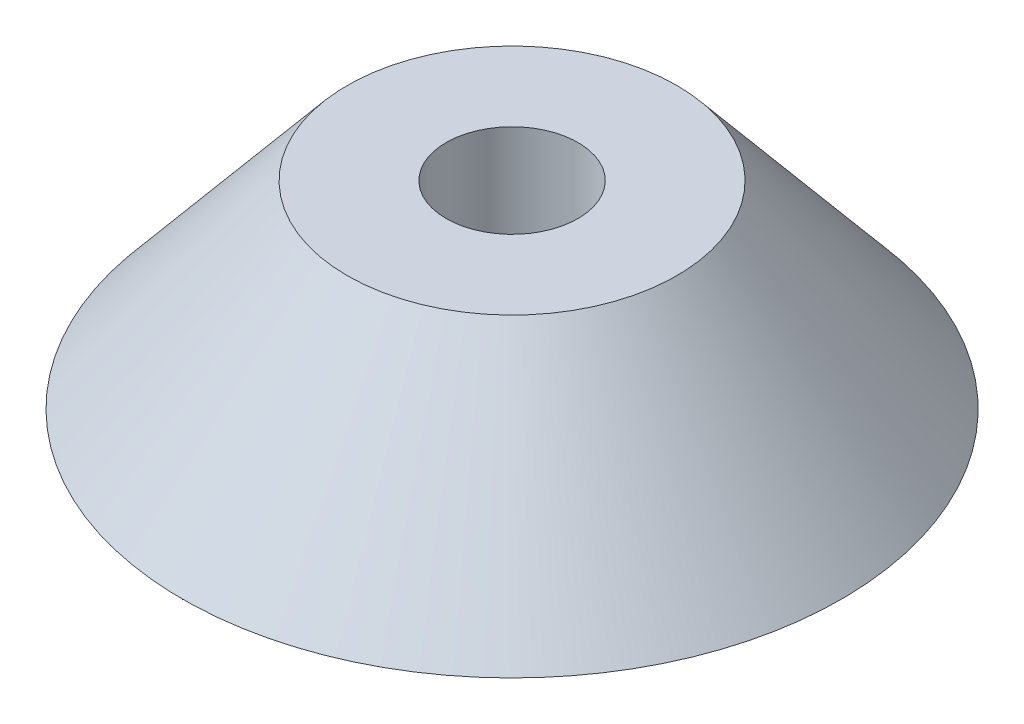
ISO-10303-21;
HEADER;
FILE_DESCRIPTION(('STEP AP214'),'2;1');
FILE_NAME('part.step','',(''),(''),'','','');
FILE_SCHEMA(('AUTOMOTIVE_DESIGN { 1 0 10303 214 1 1 1 1 }'));
ENDSEC;
DATA;
#1=APPLICATION_CONTEXT('core data for automotive mechanical design processes');
#2=APPLICATION_PROTOCOL_DEFINITION('international standard','automotive_design',2000,#1);
#3=PRODUCT_CONTEXT('',#1,'mechanical');
#4=PRODUCT('Part','Part','',(#3));
#5=PRODUCT_RELATED_PRODUCT_CATEGORY('part','',(#4));
#6=PRODUCT_DEFINITION_FORMATION('','',#4);
#7=PRODUCT_DEFINITION_CONTEXT('part definition',#1,'design');
#8=PRODUCT_DEFINITION('design','',#6,#7);
#9=PRODUCT_DEFINITION_SHAPE('','',#8);
#10=(LENGTH_UNIT() NAMED_UNIT(*) SI_UNIT(.MILLI.,.METRE.));
#11=(NAMED_UNIT(*) PLANE_ANGLE_UNIT() SI_UNIT($,.RADIAN.));
#12=(NAMED_UNIT(*) SI_UNIT($,.STERADIAN.) SOLID_ANGLE_UNIT());
#13=UNCERTAINTY_MEASURE_WITH_UNIT(LENGTH_MEASURE(1.E-05),#10,'distance_accuracy_value','');
#14=(GEOMETRIC_REPRESENTATION_CONTEXT(3) GLOBAL_UNCERTAINTY_ASSIGNED_CONTEXT((#13)) GLOBAL_UNIT_ASSIGNED_CONTEXT((#10,
#11,#12)) REPRESENTATION_CONTEXT('',''));
#15=CARTESIAN_POINT('',(0.,0.,0.));
#16=DIRECTION('',(0.,0.,1.));
#17=DIRECTION('',(1.,0.,0.));
#18=AXIS2_PLACEMENT_3D('',#15,#16,#17);
#19=CARTESIAN_POINT('',(1.5,-0.01,0.));
#20=DIRECTION('',(-0.957826285221151,0.,-0.287347885566345));
#21=DIRECTION('',(-0.287347885566345,0.,0.957826285221152));
#22=AXIS2_PLACEMENT_3D('',#19,#20,#21);
#23=PLANE('',#22);
#24=DIRECTION('',(-0.287347885566345,0.,0.957826285221151));
#25=VECTOR('',#24,1.);
#26=CARTESIAN_POINT('',(1.5,0.,0.));
#27=LINE('',#26,#25);
#28=CARTESIAN_POINT('',(1.5,0.,0.));
#29=VERTEX_POINT('',#28);
#30=CARTESIAN_POINT('',(0.,0.,5.));
#31=VERTEX_POINT('',#30);
#32=EDGE_CURVE('E102',#29,#31,#27,.T.);
#33=ORIENTED_EDGE('',*,*,#32,.T.);
#34=DIRECTION('',(0.,1.,0.));
#35=VECTOR('',#34,1.);
#36=CARTESIAN_POINT('',(0.,-0.01,5.));
#37=LINE('',#36,#35);
#38=CARTESIAN_POINT('',(0.,-0.01,5.));
#39=VERTEX_POINT('',#38);
#40=EDGE_CURVE('E12',#39,#31,#37,.T.);
#41=ORIENTED_EDGE('',*,*,#40,.F.);
#42=DIRECTION('',(-0.287347885566345,0.,0.957826285221151));
#43=VECTOR('',#42,1.);
#44=CARTESIAN_POINT('',(1.5,-0.01,0.));
#45=LINE('',#44,#43);
#46=CARTESIAN_POINT('',(1.5,-0.01,0.));
#47=VERTEX_POINT('',#46);
#48=EDGE_CURVE('E94',#47,#39,#45,.T.);
#49=ORIENTED_EDGE('',*,*,#48,.F.);
#50=DIRECTION('',(0.,1.,0.));
#51=VECTOR('',#50,1.);
#52=CARTESIAN_POINT('',(1.5,-0.01,0.));
#53=LINE('',#52,#51);
#54=EDGE_CURVE('E103',#47,#29,#53,.T.);
#55=ORIENTED_EDGE('',*,*,#54,.T.);
#56=EDGE_LOOP('',(#33,#41,#49,#55));
#57=FACE_BOUND('',#56,.T.);
#58=ADVANCED_FACE('F52',(#57),#23,.F.);
#59=CARTESIAN_POINT('',(-1.5,-0.01,0.));
#60=DIRECTION('',(0.957826285221151,0.,-0.287347885566345));
#61=DIRECTION('',(-0.287347885566345,0.,-0.957826285221152));
#62=AXIS2_PLACEMENT_3D('',#59,#60,#61);
#63=PLANE('',#62);
#64=DIRECTION('',(-0.287347885566345,0.,-0.957826285221151));
#65=VECTOR('',#64,1.);
#66=CARTESIAN_POINT('',(-1.5,0.,0.));
#67=LINE('',#66,#65);
#68=CARTESIAN_POINT('',(-1.5,0.,0.));
#69=VERTEX_POINT('',#68);
#70=EDGE_CURVE('E81',#31,#69,#67,.T.);
#71=ORIENTED_EDGE('',*,*,#70,.T.);
#72=DIRECTION('',(0.,1.,0.));
#73=VECTOR('',#72,1.);
#74=CARTESIAN_POINT('',(-1.5,-0.01,0.));
#75=LINE('',#74,#73);
#76=CARTESIAN_POINT('',(-1.5,-0.01,0.));
#77=VERTEX_POINT('',#76);
#78=EDGE_CURVE('E61',#77,#69,#75,.T.);
#79=ORIENTED_EDGE('',*,*,#78,.F.);
#80=DIRECTION('',(-0.287347885566345,0.,-0.957826285221151));
#81=VECTOR('',#80,1.);
#82=CARTESIAN_POINT('',(-1.5,-0.01,0.));
#83=LINE('',#82,#81);
#84=EDGE_CURVE('E89',#39,#77,#83,.T.);
#85=ORIENTED_EDGE('',*,*,#84,.F.);
#86=ORIENTED_EDGE('',*,*,#40,.T.);
#87=EDGE_LOOP('',(#71,#79,#85,#86));
#88=FACE_BOUND('',#87,.T.);
#89=ADVANCED_FACE('F90',(#88),#63,.F.);
#90=CARTESIAN_POINT('',(-1.5,-0.01,0.));
#91=DIRECTION('',(0.,0.,1.));
#92=DIRECTION('',(1.,0.,0.));
#93=AXIS2_PLACEMENT_3D('',#90,#91,#92);
#94=PLANE('',#93);
#95=DIRECTION('',(1.,0.,0.));
#96=VECTOR('',#95,1.);
#97=CARTESIAN_POINT('',(-1.5,0.,0.));
#98=LINE('',#97,#96);
#99=EDGE_CURVE('E86',#69,#29,#98,.T.);
#100=ORIENTED_EDGE('',*,*,#99,.T.);
#101=ORIENTED_EDGE('',*,*,#54,.F.);
#102=DIRECTION('',(1.,0.,0.));
#103=VECTOR('',#102,1.);
#104=CARTESIAN_POINT('',(-1.5,-0.01,0.));
#105=LINE('',#104,#103);
#106=EDGE_CURVE('E69',#77,#47,#105,.T.);
#107=ORIENTED_EDGE('',*,*,#106,.F.);
#108=ORIENTED_EDGE('',*,*,#78,.T.);
#109=EDGE_LOOP('',(#100,#101,#107,#108));
#110=FACE_BOUND('',#109,.T.);
#111=ADVANCED_FACE('F115',(#110),#94,.F.);
#112=CARTESIAN_POINT('',(0.,-0.01,0.));
#113=DIRECTION('',(0.,1.,0.));
#114=DIRECTION('',(0.,0.,1.));
#115=AXIS2_PLACEMENT_3D('',#112,#113,#114);
#116=PLANE('',#115);
#117=ORIENTED_EDGE('',*,*,#48,.T.);
#118=ORIENTED_EDGE('',*,*,#84,.T.);
#119=ORIENTED_EDGE('',*,*,#106,.T.);
#120=EDGE_LOOP('',(#117,#118,#119));
#121=FACE_BOUND('',#120,.T.);
#122=ADVANCED_FACE('F97',(#121),#116,.F.);
#123=CARTESIAN_POINT('',(0.,0.,0.));
#124=DIRECTION('',(0.,1.,0.));
#125=DIRECTION('',(0.,0.,1.));
#126=AXIS2_PLACEMENT_3D('',#123,#124,#125);
#127=PLANE('',#126);
#128=ORIENTED_EDGE('',*,*,#32,.F.);
#129=ORIENTED_EDGE('',*,*,#99,.F.);
#130=ORIENTED_EDGE('',*,*,#70,.F.);
#131=EDGE_LOOP('',(#128,#129,#130));
#132=FACE_BOUND('',#131,.T.);
#133=ADVANCED_FACE('F116',(#132),#127,.T.);
#134=CLOSED_SHELL('',(#58,#89,#111,#122,#133));
#135=MANIFOLD_SOLID_BREP('B2',#134);
#136=CARTESIAN_POINT('',(0.,0.,0.));
#137=DIRECTION('',(0.,1.,0.));
#138=DIRECTION('',(0.,0.,1.));
#139=AXIS2_PLACEMENT_3D('',#136,#137,#138);
#140=PLANE('',#139);
#141=CARTESIAN_POINT('',(0.,0.,0.));
#142=DIRECTION('',(0.,-1.,0.));
#143=DIRECTION('',(0.,0.,-1.));
#144=AXIS2_PLACEMENT_3D('',#141,#142,#143);
#145=CIRCLE('',#144,5.);
#146=CARTESIAN_POINT('',(0.,0.,-5.));
#147=VERTEX_POINT('',#146);
#148=EDGE_CURVE('E51',#147,#147,#145,.T.);
#149=ORIENTED_EDGE('',*,*,#148,.T.);
#150=EDGE_LOOP('',(#149));
#151=FACE_BOUND('',#150,.T.);
#152=ADVANCED_FACE('F175',(#151),#140,.F.);
#153=CARTESIAN_POINT('',(0.,3.,0.));
#154=DIRECTION('',(0.,-1.,0.));
#155=DIRECTION('',(0.,0.,-1.));
#156=AXIS2_PLACEMENT_3D('',#153,#154,#155);
#157=CONICAL_SURFACE('',#156,2.5,0.694738276196703);
#158=ORIENTED_EDGE('',*,*,#148,.F.);
#159=EDGE_LOOP('',(#158));
#160=FACE_BOUND('',#159,.T.);
#161=CARTESIAN_POINT('',(0.,3.,0.));
#162=DIRECTION('',(0.,-1.,0.));
#163=DIRECTION('',(0.,0.,-1.));
#164=AXIS2_PLACEMENT_3D('',#161,#162,#163);
#165=CIRCLE('',#164,2.5);
#166=CARTESIAN_POINT('',(0.,3.,-2.5));
#167=VERTEX_POINT('',#166);
#168=EDGE_CURVE('E182',#167,#167,#165,.T.);
#169=ORIENTED_EDGE('',*,*,#168,.T.);
#170=EDGE_LOOP('',(#169));
#171=FACE_BOUND('',#170,.T.);
#172=ADVANCED_FACE('F204',(#160,#171),#157,.T.);
#173=CARTESIAN_POINT('',(0.,3.,0.));
#174=DIRECTION('',(0.,-1.,0.));
#175=DIRECTION('',(0.,0.,-1.));
#176=AXIS2_PLACEMENT_3D('',#173,#174,#175);
#177=PLANE('',#176);
#178=CARTESIAN_POINT('',(0.,3.,0.));
#179=DIRECTION('',(0.,1.,0.));
#180=DIRECTION('',(0.,0.,1.));
#181=AXIS2_PLACEMENT_3D('',#178,#179,#180);
#182=CIRCLE('',#181,1.);
#183=CARTESIAN_POINT('',(0.,3.,1.));
#184=VERTEX_POINT('',#183);
#185=EDGE_CURVE('E193',#184,#184,#182,.T.);
#186=ORIENTED_EDGE('',*,*,#185,.F.);
#187=EDGE_LOOP('',(#186));
#188=FACE_BOUND('',#187,.T.);
#189=ORIENTED_EDGE('',*,*,#168,.F.);
#190=EDGE_LOOP('',(#189));
#191=FACE_BOUND('',#190,.T.);
#192=ADVANCED_FACE('F201',(#188,#191),#177,.F.);
#193=CARTESIAN_POINT('',(0.,1.2,0.));
#194=DIRECTION('',(0.,1.,0.));
#195=DIRECTION('',(0.,0.,1.));
#196=AXIS2_PLACEMENT_3D('',#193,#194,#195);
#197=CYLINDRICAL_SURFACE('',#196,1.);
#198=CARTESIAN_POINT('',(0.,1.2,0.));
#199=DIRECTION('',(0.,1.,0.));
#200=DIRECTION('',(0.,0.,1.));
#201=AXIS2_PLACEMENT_3D('',#198,#199,#200);
#202=CIRCLE('',#201,1.);
#203=CARTESIAN_POINT('',(0.,1.2,1.));
#204=VERTEX_POINT('',#203);
#205=EDGE_CURVE('E189',#204,#204,#202,.T.);
#206=ORIENTED_EDGE('',*,*,#205,.F.);
#207=EDGE_LOOP('',(#206));
#208=FACE_BOUND('',#207,.T.);
#209=ORIENTED_EDGE('',*,*,#185,.T.);
#210=EDGE_LOOP('',(#209));
#211=FACE_BOUND('',#210,.T.);
#212=ADVANCED_FACE('F199',(#208,#211),#197,.F.);
#213=CARTESIAN_POINT('',(0.,1.2,0.));
#214=DIRECTION('',(0.,1.,0.));
#215=DIRECTION('',(0.,0.,1.));
#216=AXIS2_PLACEMENT_3D('',#213,#214,#215);
#217=PLANE('',#216);
#218=ORIENTED_EDGE('',*,*,#205,.T.);
#219=EDGE_LOOP('',(#218));
#220=FACE_BOUND('',#219,.T.);
#221=ADVANCED_FACE('F210',(#220),#217,.T.);
#222=CLOSED_SHELL('',(#152,#172,#192,#212,#221));
#223=MANIFOLD_SOLID_BREP('B6',#222);
#224=ADVANCED_BREP_SHAPE_REPRESENTATION('',(#18,#135,#223),#14);
#225=SHAPE_DEFINITION_REPRESENTATION(#9,#224);
ENDSEC;
END-ISO-10303-21;
